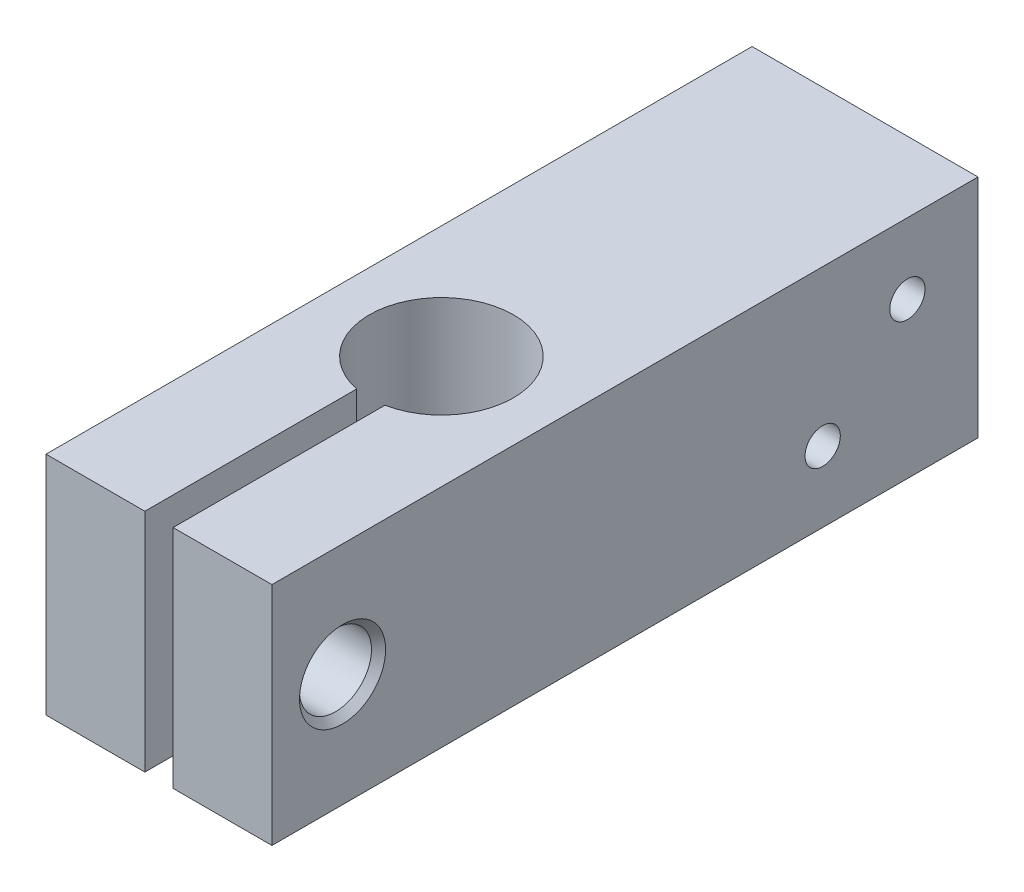
ISO-10303-21;
HEADER;
FILE_DESCRIPTION(('STEP AP214'),'2;1');
FILE_NAME('part.step','',(''),(''),'','','');
FILE_SCHEMA(('AUTOMOTIVE_DESIGN { 1 0 10303 214 1 1 1 1 }'));
ENDSEC;
DATA;
#1=APPLICATION_CONTEXT('core data for automotive mechanical design processes');
#2=APPLICATION_PROTOCOL_DEFINITION('international standard','automotive_design',2000,#1);
#3=PRODUCT_CONTEXT('',#1,'mechanical');
#4=PRODUCT('Part','Part','',(#3));
#5=PRODUCT_RELATED_PRODUCT_CATEGORY('part','',(#4));
#6=PRODUCT_DEFINITION_FORMATION('','',#4);
#7=PRODUCT_DEFINITION_CONTEXT('part definition',#1,'design');
#8=PRODUCT_DEFINITION('design','',#6,#7);
#9=PRODUCT_DEFINITION_SHAPE('','',#8);
#10=(LENGTH_UNIT() NAMED_UNIT(*) SI_UNIT(.MILLI.,.METRE.));
#11=(NAMED_UNIT(*) PLANE_ANGLE_UNIT() SI_UNIT($,.RADIAN.));
#12=(NAMED_UNIT(*) SI_UNIT($,.STERADIAN.) SOLID_ANGLE_UNIT());
#13=UNCERTAINTY_MEASURE_WITH_UNIT(LENGTH_MEASURE(1.E-05),#10,'distance_accuracy_value','');
#14=(GEOMETRIC_REPRESENTATION_CONTEXT(3) GLOBAL_UNCERTAINTY_ASSIGNED_CONTEXT((#13)) GLOBAL_UNIT_ASSIGNED_CONTEXT((#10,
#11,#12)) REPRESENTATION_CONTEXT('',''));
#15=CARTESIAN_POINT('',(0.,0.,0.));
#16=DIRECTION('',(0.,0.,1.));
#17=DIRECTION('',(1.,0.,0.));
#18=AXIS2_PLACEMENT_3D('',#15,#16,#17);
#19=CARTESIAN_POINT('',(8.,8.,50.));
#20=DIRECTION('',(0.,-1.,0.));
#21=DIRECTION('',(1.,0.,0.));
#22=AXIS2_PLACEMENT_3D('',#19,#20,#21);
#23=PLANE('',#22);
#24=CARTESIAN_POINT('',(0.,8.,30.));
#25=DIRECTION('',(0.,1.,0.));
#26=DIRECTION('',(0.,0.,1.));
#27=AXIS2_PLACEMENT_3D('',#24,#25,#26);
#28=CIRCLE('',#27,5.09999999999999);
#29=CARTESIAN_POINT('',(1.,8.,35.00099990002));
#30=VERTEX_POINT('',#29);
#31=CARTESIAN_POINT('',(-0.999999999999999,8.,35.00099990002));
#32=VERTEX_POINT('',#31);
#33=EDGE_CURVE('E51',#30,#32,#28,.T.);
#34=ORIENTED_EDGE('',*,*,#33,.F.);
#35=DIRECTION('',(0.,0.,-1.));
#36=VECTOR('',#35,1.);
#37=CARTESIAN_POINT('',(1.00000000000001,8.,0.));
#38=LINE('',#37,#36);
#39=CARTESIAN_POINT('',(1.00000000000001,8.,50.));
#40=VERTEX_POINT('',#39);
#41=EDGE_CURVE('E114',#40,#30,#38,.T.);
#42=ORIENTED_EDGE('',*,*,#41,.F.);
#43=DIRECTION('',(-1.,0.,0.));
#44=VECTOR('',#43,1.);
#45=CARTESIAN_POINT('',(8.,8.,50.));
#46=LINE('',#45,#44);
#47=CARTESIAN_POINT('',(8.,8.,50.));
#48=VERTEX_POINT('',#47);
#49=EDGE_CURVE('E144',#48,#40,#46,.T.);
#50=ORIENTED_EDGE('',*,*,#49,.F.);
#51=DIRECTION('',(0.,0.,-1.));
#52=VECTOR('',#51,1.);
#53=CARTESIAN_POINT('',(8.,8.,50.));
#54=LINE('',#53,#52);
#55=CARTESIAN_POINT('',(8.,8.,0.));
#56=VERTEX_POINT('',#55);
#57=EDGE_CURVE('E157',#48,#56,#54,.T.);
#58=ORIENTED_EDGE('',*,*,#57,.T.);
#59=DIRECTION('',(-1.,0.,0.));
#60=VECTOR('',#59,1.);
#61=CARTESIAN_POINT('',(8.,8.,0.));
#62=LINE('',#61,#60);
#63=CARTESIAN_POINT('',(-8.,8.,0.));
#64=VERTEX_POINT('',#63);
#65=EDGE_CURVE('E137',#56,#64,#62,.T.);
#66=ORIENTED_EDGE('',*,*,#65,.T.);
#67=DIRECTION('',(0.,0.,-1.));
#68=VECTOR('',#67,1.);
#69=CARTESIAN_POINT('',(-8.,8.,50.));
#70=LINE('',#69,#68);
#71=CARTESIAN_POINT('',(-8.,8.,50.));
#72=VERTEX_POINT('',#71);
#73=EDGE_CURVE('E147',#72,#64,#70,.T.);
#74=ORIENTED_EDGE('',*,*,#73,.F.);
#75=CARTESIAN_POINT('',(-0.999999999999999,8.,50.));
#76=VERTEX_POINT('',#75);
#77=EDGE_CURVE('E143',#76,#72,#46,.T.);
#78=ORIENTED_EDGE('',*,*,#77,.F.);
#79=DIRECTION('',(0.,0.,-1.));
#80=VECTOR('',#79,1.);
#81=CARTESIAN_POINT('',(-1.00000000000001,8.,0.));
#82=LINE('',#81,#80);
#83=EDGE_CURVE('E58',#76,#32,#82,.T.);
#84=ORIENTED_EDGE('',*,*,#83,.T.);
#85=EDGE_LOOP('',(#34,#42,#50,#58,#66,#74,#78,#84));
#86=FACE_BOUND('',#85,.T.);
#87=ADVANCED_FACE('F37',(#86),#23,.F.);
#88=CARTESIAN_POINT('',(0.,0.,50.));
#89=DIRECTION('',(0.,0.,1.));
#90=DIRECTION('',(1.,0.,0.));
#91=AXIS2_PLACEMENT_3D('',#88,#89,#90);
#92=PLANE('',#91);
#93=DIRECTION('',(1.,0.,0.));
#94=VECTOR('',#93,1.);
#95=CARTESIAN_POINT('',(8.,-8.,50.));
#96=LINE('',#95,#94);
#97=CARTESIAN_POINT('',(-8.,-8.,50.));
#98=VERTEX_POINT('',#97);
#99=CARTESIAN_POINT('',(-0.999999999999995,-8.,50.));
#100=VERTEX_POINT('',#99);
#101=EDGE_CURVE('E138',#98,#100,#96,.T.);
#102=ORIENTED_EDGE('',*,*,#101,.T.);
#103=DIRECTION('',(0.,1.,0.));
#104=VECTOR('',#103,1.);
#105=CARTESIAN_POINT('',(-0.999999999999995,-8.,50.));
#106=LINE('',#105,#104);
#107=EDGE_CURVE('E121',#100,#76,#106,.T.);
#108=ORIENTED_EDGE('',*,*,#107,.T.);
#109=ORIENTED_EDGE('',*,*,#77,.T.);
#110=DIRECTION('',(0.,-1.,0.));
#111=VECTOR('',#110,1.);
#112=CARTESIAN_POINT('',(-8.,-8.,50.));
#113=LINE('',#112,#111);
#114=EDGE_CURVE('E134',#72,#98,#113,.T.);
#115=ORIENTED_EDGE('',*,*,#114,.T.);
#116=EDGE_LOOP('',(#102,#108,#109,#115));
#117=FACE_BOUND('',#116,.T.);
#118=ADVANCED_FACE('F220',(#117),#92,.T.);
#119=CARTESIAN_POINT('',(-8.,-8.,50.));
#120=DIRECTION('',(1.,0.,0.));
#121=DIRECTION('',(0.,0.,-1.));
#122=AXIS2_PLACEMENT_3D('',#119,#120,#121);
#123=PLANE('',#122);
#124=CARTESIAN_POINT('',(-8.,3.,5.));
#125=DIRECTION('',(1.,0.,0.));
#126=DIRECTION('',(0.,0.,-1.));
#127=AXIS2_PLACEMENT_3D('',#124,#125,#126);
#128=CIRCLE('',#127,1.24999999999999);
#129=CARTESIAN_POINT('',(-8.,3.,3.75000000000001));
#130=VERTEX_POINT('',#129);
#131=EDGE_CURVE('E187',#130,#130,#128,.T.);
#132=ORIENTED_EDGE('',*,*,#131,.T.);
#133=EDGE_LOOP('',(#132));
#134=FACE_BOUND('',#133,.T.);
#135=CARTESIAN_POINT('',(-8.,-3.,11.));
#136=DIRECTION('',(1.,0.,0.));
#137=DIRECTION('',(0.,0.,-1.));
#138=AXIS2_PLACEMENT_3D('',#135,#136,#137);
#139=CIRCLE('',#138,1.24999999999999);
#140=CARTESIAN_POINT('',(-8.,-3.,9.75000000000001));
#141=VERTEX_POINT('',#140);
#142=EDGE_CURVE('E181',#141,#141,#139,.T.);
#143=ORIENTED_EDGE('',*,*,#142,.T.);
#144=EDGE_LOOP('',(#143));
#145=FACE_BOUND('',#144,.T.);
#146=CARTESIAN_POINT('',(-8.,0.,45.));
#147=DIRECTION('',(-1.,0.,0.));
#148=DIRECTION('',(0.,0.,1.));
#149=AXIS2_PLACEMENT_3D('',#146,#147,#148);
#150=CIRCLE('',#149,2.1);
#151=CARTESIAN_POINT('',(-8.,0.,47.1));
#152=VERTEX_POINT('',#151);
#153=EDGE_CURVE('E178',#152,#152,#150,.T.);
#154=ORIENTED_EDGE('',*,*,#153,.F.);
#155=EDGE_LOOP('',(#154));
#156=FACE_BOUND('',#155,.T.);
#157=DIRECTION('',(0.,-1.,0.));
#158=VECTOR('',#157,1.);
#159=CARTESIAN_POINT('',(-8.,-8.,0.));
#160=LINE('',#159,#158);
#161=CARTESIAN_POINT('',(-8.,-8.,0.));
#162=VERTEX_POINT('',#161);
#163=EDGE_CURVE('E132',#64,#162,#160,.T.);
#164=ORIENTED_EDGE('',*,*,#163,.T.);
#165=DIRECTION('',(0.,0.,-1.));
#166=VECTOR('',#165,1.);
#167=CARTESIAN_POINT('',(-8.,-8.,50.));
#168=LINE('',#167,#166);
#169=EDGE_CURVE('E45',#98,#162,#168,.T.);
#170=ORIENTED_EDGE('',*,*,#169,.F.);
#171=ORIENTED_EDGE('',*,*,#114,.F.);
#172=ORIENTED_EDGE('',*,*,#73,.T.);
#173=EDGE_LOOP('',(#164,#170,#171,#172));
#174=FACE_BOUND('',#173,.T.);
#175=ADVANCED_FACE('F39',(#134,#145,#156,#174),#123,.F.);
#176=CARTESIAN_POINT('',(8.,-8.,50.));
#177=DIRECTION('',(0.,1.,0.));
#178=DIRECTION('',(-1.,0.,0.));
#179=AXIS2_PLACEMENT_3D('',#176,#177,#178);
#180=PLANE('',#179);
#181=DIRECTION('',(0.,0.,-1.));
#182=VECTOR('',#181,1.);
#183=CARTESIAN_POINT('',(1.00000000000001,-8.,0.));
#184=LINE('',#183,#182);
#185=CARTESIAN_POINT('',(1.00000000000001,-8.,50.));
#186=VERTEX_POINT('',#185);
#187=CARTESIAN_POINT('',(1.00000000000001,-8.,35.00099990002));
#188=VERTEX_POINT('',#187);
#189=EDGE_CURVE('E111',#186,#188,#184,.T.);
#190=ORIENTED_EDGE('',*,*,#189,.T.);
#191=CARTESIAN_POINT('',(0.,-8.,30.));
#192=DIRECTION('',(0.,1.,0.));
#193=DIRECTION('',(0.,0.,1.));
#194=AXIS2_PLACEMENT_3D('',#191,#192,#193);
#195=CIRCLE('',#194,5.1);
#196=CARTESIAN_POINT('',(-0.999999999999997,-8.,35.00099990002));
#197=VERTEX_POINT('',#196);
#198=EDGE_CURVE('E99',#188,#197,#195,.T.);
#199=ORIENTED_EDGE('',*,*,#198,.T.);
#200=DIRECTION('',(0.,0.,-1.));
#201=VECTOR('',#200,1.);
#202=CARTESIAN_POINT('',(-1.00000000000001,-8.,0.));
#203=LINE('',#202,#201);
#204=EDGE_CURVE('E122',#100,#197,#203,.T.);
#205=ORIENTED_EDGE('',*,*,#204,.F.);
#206=ORIENTED_EDGE('',*,*,#101,.F.);
#207=ORIENTED_EDGE('',*,*,#169,.T.);
#208=DIRECTION('',(1.,0.,0.));
#209=VECTOR('',#208,1.);
#210=CARTESIAN_POINT('',(8.,-8.,0.));
#211=LINE('',#210,#209);
#212=CARTESIAN_POINT('',(8.,-8.,0.));
#213=VERTEX_POINT('',#212);
#214=EDGE_CURVE('E150',#162,#213,#211,.T.);
#215=ORIENTED_EDGE('',*,*,#214,.T.);
#216=DIRECTION('',(0.,0.,-1.));
#217=VECTOR('',#216,1.);
#218=CARTESIAN_POINT('',(8.,-8.,50.));
#219=LINE('',#218,#217);
#220=CARTESIAN_POINT('',(8.,-8.,50.));
#221=VERTEX_POINT('',#220);
#222=EDGE_CURVE('E160',#221,#213,#219,.T.);
#223=ORIENTED_EDGE('',*,*,#222,.F.);
#224=EDGE_CURVE('E120',#186,#221,#96,.T.);
#225=ORIENTED_EDGE('',*,*,#224,.F.);
#226=EDGE_LOOP('',(#190,#199,#205,#206,#207,#215,#223,#225));
#227=FACE_BOUND('',#226,.T.);
#228=ADVANCED_FACE('F118',(#227),#180,.F.);
#229=CARTESIAN_POINT('',(8.,-8.,50.));
#230=DIRECTION('',(-1.,0.,0.));
#231=DIRECTION('',(0.,0.,1.));
#232=AXIS2_PLACEMENT_3D('',#229,#230,#231);
#233=PLANE('',#232);
#234=CARTESIAN_POINT('',(8.,3.,5.));
#235=DIRECTION('',(1.,0.,0.));
#236=DIRECTION('',(0.,0.,-1.));
#237=AXIS2_PLACEMENT_3D('',#234,#235,#236);
#238=CIRCLE('',#237,1.24999999999999);
#239=CARTESIAN_POINT('',(8.,3.,3.75000000000001));
#240=VERTEX_POINT('',#239);
#241=EDGE_CURVE('E115',#240,#240,#238,.T.);
#242=ORIENTED_EDGE('',*,*,#241,.F.);
#243=EDGE_LOOP('',(#242));
#244=FACE_BOUND('',#243,.T.);
#245=CARTESIAN_POINT('',(8.,-3.,11.));
#246=DIRECTION('',(1.,0.,0.));
#247=DIRECTION('',(0.,0.,-1.));
#248=AXIS2_PLACEMENT_3D('',#245,#246,#247);
#249=CIRCLE('',#248,1.24999999999999);
#250=CARTESIAN_POINT('',(8.,-3.,9.75000000000001));
#251=VERTEX_POINT('',#250);
#252=EDGE_CURVE('E184',#251,#251,#249,.T.);
#253=ORIENTED_EDGE('',*,*,#252,.F.);
#254=EDGE_LOOP('',(#253));
#255=FACE_BOUND('',#254,.T.);
#256=CARTESIAN_POINT('',(8.,0.,45.));
#257=DIRECTION('',(1.,0.,0.));
#258=DIRECTION('',(0.,0.,-1.));
#259=AXIS2_PLACEMENT_3D('',#256,#257,#258);
#260=CIRCLE('',#259,3.05);
#261=CARTESIAN_POINT('',(8.,0.,41.95));
#262=VERTEX_POINT('',#261);
#263=EDGE_CURVE('E169',#262,#262,#260,.T.);
#264=ORIENTED_EDGE('',*,*,#263,.F.);
#265=EDGE_LOOP('',(#264));
#266=FACE_BOUND('',#265,.T.);
#267=DIRECTION('',(0.,1.,0.));
#268=VECTOR('',#267,1.);
#269=CARTESIAN_POINT('',(8.,-8.,0.));
#270=LINE('',#269,#268);
#271=EDGE_CURVE('E152',#213,#56,#270,.T.);
#272=ORIENTED_EDGE('',*,*,#271,.T.);
#273=ORIENTED_EDGE('',*,*,#57,.F.);
#274=DIRECTION('',(0.,1.,0.));
#275=VECTOR('',#274,1.);
#276=CARTESIAN_POINT('',(8.,-8.,50.));
#277=LINE('',#276,#275);
#278=EDGE_CURVE('E141',#221,#48,#277,.T.);
#279=ORIENTED_EDGE('',*,*,#278,.F.);
#280=ORIENTED_EDGE('',*,*,#222,.T.);
#281=EDGE_LOOP('',(#272,#273,#279,#280));
#282=FACE_BOUND('',#281,.T.);
#283=ADVANCED_FACE('F196',(#244,#255,#266,#282),#233,.F.);
#284=DIRECTION('',(0.,1.,0.));
#285=VECTOR('',#284,1.);
#286=CARTESIAN_POINT('',(1.00000000000001,-8.,50.));
#287=LINE('',#286,#285);
#288=EDGE_CURVE('E124',#186,#40,#287,.T.);
#289=ORIENTED_EDGE('',*,*,#288,.F.);
#290=ORIENTED_EDGE('',*,*,#224,.T.);
#291=ORIENTED_EDGE('',*,*,#278,.T.);
#292=ORIENTED_EDGE('',*,*,#49,.T.);
#293=EDGE_LOOP('',(#289,#290,#291,#292));
#294=FACE_BOUND('',#293,.T.);
#295=ADVANCED_FACE('F199',(#294),#92,.T.);
#296=CARTESIAN_POINT('',(0.,0.,0.));
#297=DIRECTION('',(0.,0.,1.));
#298=DIRECTION('',(1.,0.,0.));
#299=AXIS2_PLACEMENT_3D('',#296,#297,#298);
#300=PLANE('',#299);
#301=ORIENTED_EDGE('',*,*,#163,.F.);
#302=ORIENTED_EDGE('',*,*,#65,.F.);
#303=ORIENTED_EDGE('',*,*,#271,.F.);
#304=ORIENTED_EDGE('',*,*,#214,.F.);
#305=EDGE_LOOP('',(#301,#302,#303,#304));
#306=FACE_BOUND('',#305,.T.);
#307=ADVANCED_FACE('F214',(#306),#300,.F.);
#308=CARTESIAN_POINT('',(1.00000000000001,-8.,0.));
#309=DIRECTION('',(1.,0.,0.));
#310=DIRECTION('',(0.,1.,0.));
#311=AXIS2_PLACEMENT_3D('',#308,#309,#310);
#312=PLANE('',#311);
#313=CARTESIAN_POINT('',(1.00000000000001,0.,45.));
#314=DIRECTION('',(1.,0.,0.));
#315=DIRECTION('',(0.,1.,0.));
#316=AXIS2_PLACEMENT_3D('',#313,#314,#315);
#317=CIRCLE('',#316,2.54999999999999);
#318=CARTESIAN_POINT('',(1.00000000000001,2.54999999999999,45.));
#319=VERTEX_POINT('',#318);
#320=EDGE_CURVE('E130',#319,#319,#317,.T.);
#321=ORIENTED_EDGE('',*,*,#320,.T.);
#322=EDGE_LOOP('',(#321));
#323=FACE_BOUND('',#322,.T.);
#324=ORIENTED_EDGE('',*,*,#41,.T.);
#325=DIRECTION('',(0.,1.,0.));
#326=VECTOR('',#325,1.);
#327=CARTESIAN_POINT('',(1.00000000000001,8.,35.00099990002));
#328=LINE('',#327,#326);
#329=EDGE_CURVE('E102',#30,#188,#328,.F.);
#330=ORIENTED_EDGE('',*,*,#329,.T.);
#331=ORIENTED_EDGE('',*,*,#189,.F.);
#332=ORIENTED_EDGE('',*,*,#288,.T.);
#333=EDGE_LOOP('',(#324,#330,#331,#332));
#334=FACE_BOUND('',#333,.T.);
#335=ADVANCED_FACE('F110',(#323,#334),#312,.F.);
#336=CARTESIAN_POINT('',(-1.00000000000001,-8.,0.));
#337=DIRECTION('',(1.,0.,0.));
#338=DIRECTION('',(0.,0.,-1.));
#339=AXIS2_PLACEMENT_3D('',#336,#337,#338);
#340=PLANE('',#339);
#341=DIRECTION('',(0.,1.,0.));
#342=VECTOR('',#341,1.);
#343=CARTESIAN_POINT('',(-0.999999999999998,8.,35.00099990002));
#344=LINE('',#343,#342);
#345=EDGE_CURVE('E11',#32,#197,#344,.F.);
#346=ORIENTED_EDGE('',*,*,#345,.F.);
#347=ORIENTED_EDGE('',*,*,#83,.F.);
#348=ORIENTED_EDGE('',*,*,#107,.F.);
#349=ORIENTED_EDGE('',*,*,#204,.T.);
#350=EDGE_LOOP('',(#346,#347,#348,#349));
#351=FACE_BOUND('',#350,.T.);
#352=CARTESIAN_POINT('',(-0.999999999999995,0.,45.));
#353=DIRECTION('',(1.,0.,0.));
#354=DIRECTION('',(0.,0.,-1.));
#355=AXIS2_PLACEMENT_3D('',#352,#353,#354);
#356=CIRCLE('',#355,2.1);
#357=CARTESIAN_POINT('',(-0.999999999999995,0.,42.9));
#358=VERTEX_POINT('',#357);
#359=EDGE_CURVE('E173',#358,#358,#356,.T.);
#360=ORIENTED_EDGE('',*,*,#359,.F.);
#361=EDGE_LOOP('',(#360));
#362=FACE_BOUND('',#361,.T.);
#363=ADVANCED_FACE('F221',(#351,#362),#340,.T.);
#364=CARTESIAN_POINT('',(8.,0.,45.));
#365=DIRECTION('',(1.,0.,0.));
#366=DIRECTION('',(0.,0.,-1.));
#367=AXIS2_PLACEMENT_3D('',#364,#365,#366);
#368=CYLINDRICAL_SURFACE('',#367,2.54999999999999);
#369=CARTESIAN_POINT('',(7.5,0.,45.));
#370=DIRECTION('',(1.,0.,0.));
#371=DIRECTION('',(0.,0.,-1.));
#372=AXIS2_PLACEMENT_3D('',#369,#370,#371);
#373=CIRCLE('',#372,2.55);
#374=CARTESIAN_POINT('',(7.5,0.,42.45));
#375=VERTEX_POINT('',#374);
#376=EDGE_CURVE('E165',#375,#375,#373,.T.);
#377=ORIENTED_EDGE('',*,*,#376,.T.);
#378=EDGE_LOOP('',(#377));
#379=FACE_BOUND('',#378,.T.);
#380=ORIENTED_EDGE('',*,*,#320,.F.);
#381=EDGE_LOOP('',(#380));
#382=FACE_BOUND('',#381,.T.);
#383=ADVANCED_FACE('F261',(#379,#382),#368,.F.);
#384=CARTESIAN_POINT('',(8.,0.,45.));
#385=DIRECTION('',(1.,0.,0.));
#386=DIRECTION('',(0.,0.,-1.));
#387=AXIS2_PLACEMENT_3D('',#384,#385,#386);
#388=CONICAL_SURFACE('',#387,3.05,0.78539816339745);
#389=ORIENTED_EDGE('',*,*,#376,.F.);
#390=EDGE_LOOP('',(#389));
#391=FACE_BOUND('',#390,.T.);
#392=ORIENTED_EDGE('',*,*,#263,.T.);
#393=EDGE_LOOP('',(#392));
#394=FACE_BOUND('',#393,.T.);
#395=ADVANCED_FACE('F252',(#391,#394),#388,.F.);
#396=CARTESIAN_POINT('',(-8.,0.,45.));
#397=DIRECTION('',(-1.,0.,0.));
#398=DIRECTION('',(0.,0.,1.));
#399=AXIS2_PLACEMENT_3D('',#396,#397,#398);
#400=CYLINDRICAL_SURFACE('',#399,2.1);
#401=ORIENTED_EDGE('',*,*,#359,.T.);
#402=EDGE_LOOP('',(#401));
#403=FACE_BOUND('',#402,.T.);
#404=ORIENTED_EDGE('',*,*,#153,.T.);
#405=EDGE_LOOP('',(#404));
#406=FACE_BOUND('',#405,.T.);
#407=ADVANCED_FACE('F249',(#403,#406),#400,.F.);
#408=CARTESIAN_POINT('',(8.,-3.,11.));
#409=DIRECTION('',(1.,0.,0.));
#410=DIRECTION('',(0.,0.,-1.));
#411=AXIS2_PLACEMENT_3D('',#408,#409,#410);
#412=CYLINDRICAL_SURFACE('',#411,1.24999999999999);
#413=ORIENTED_EDGE('',*,*,#142,.F.);
#414=EDGE_LOOP('',(#413));
#415=FACE_BOUND('',#414,.T.);
#416=ORIENTED_EDGE('',*,*,#252,.T.);
#417=EDGE_LOOP('',(#416));
#418=FACE_BOUND('',#417,.T.);
#419=ADVANCED_FACE('F251',(#415,#418),#412,.F.);
#420=CARTESIAN_POINT('',(8.,3.,5.));
#421=DIRECTION('',(1.,0.,0.));
#422=DIRECTION('',(0.,0.,-1.));
#423=AXIS2_PLACEMENT_3D('',#420,#421,#422);
#424=CYLINDRICAL_SURFACE('',#423,1.24999999999999);
#425=ORIENTED_EDGE('',*,*,#131,.F.);
#426=EDGE_LOOP('',(#425));
#427=FACE_BOUND('',#426,.T.);
#428=ORIENTED_EDGE('',*,*,#241,.T.);
#429=EDGE_LOOP('',(#428));
#430=FACE_BOUND('',#429,.T.);
#431=ADVANCED_FACE('F194',(#427,#430),#424,.F.);
#432=CARTESIAN_POINT('',(0.,8.,30.));
#433=DIRECTION('',(0.,1.,0.));
#434=DIRECTION('',(0.,0.,1.));
#435=AXIS2_PLACEMENT_3D('',#432,#433,#434);
#436=CYLINDRICAL_SURFACE('',#435,5.09999999999999);
#437=ORIENTED_EDGE('',*,*,#33,.T.);
#438=ORIENTED_EDGE('',*,*,#345,.T.);
#439=ORIENTED_EDGE('',*,*,#198,.F.);
#440=ORIENTED_EDGE('',*,*,#329,.F.);
#441=EDGE_LOOP('',(#437,#438,#439,#440));
#442=FACE_BOUND('',#441,.T.);
#443=ADVANCED_FACE('F101',(#442),#436,.F.);
#444=CLOSED_SHELL('',(#87,#118,#175,#228,#283,#295,#307,#335,#363,#383,#395,#407,#419,#431,#443));
#445=MANIFOLD_SOLID_BREP('B2',#444);
#446=ADVANCED_BREP_SHAPE_REPRESENTATION('',(#18,#445),#14);
#447=SHAPE_DEFINITION_REPRESENTATION(#9,#446);
ENDSEC;
END-ISO-10303-21;
